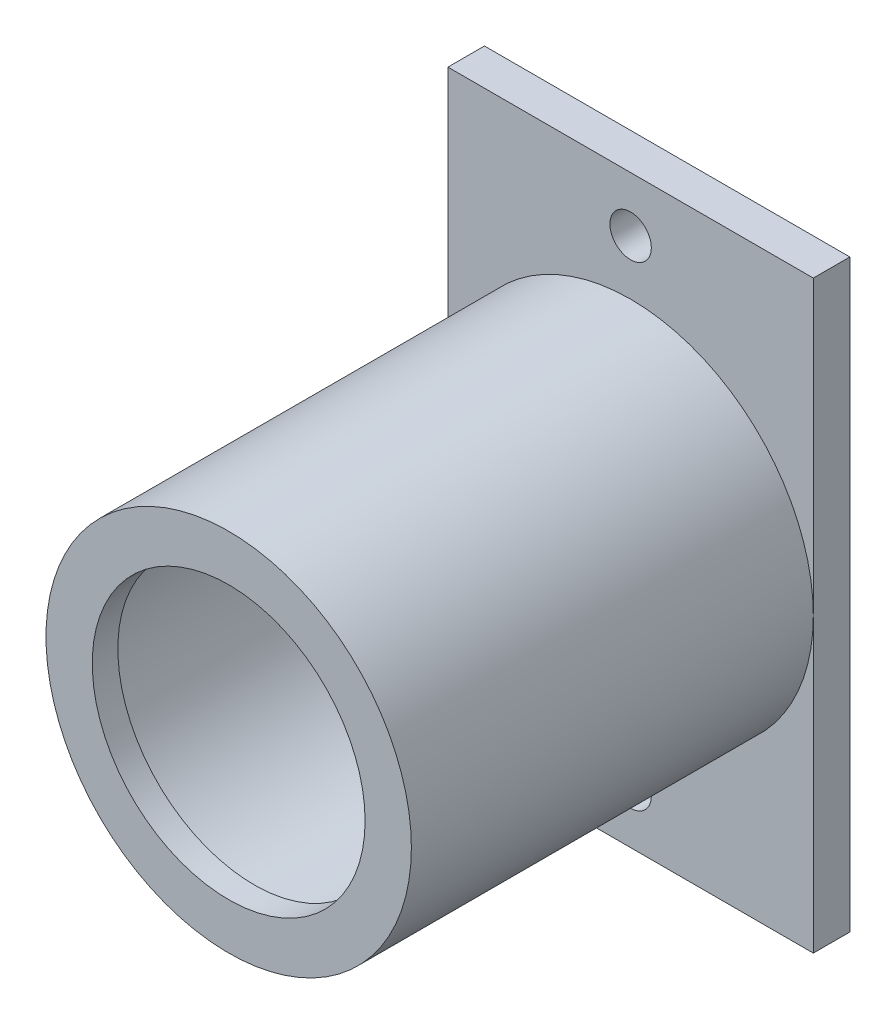
ISO-10303-21;
HEADER;
FILE_DESCRIPTION(('STEP AP214'),'2;1');
FILE_NAME('part.step','',(''),(''),'','','');
FILE_SCHEMA(('AUTOMOTIVE_DESIGN { 1 0 10303 214 1 1 1 1 }'));
ENDSEC;
DATA;
#1=APPLICATION_CONTEXT('core data for automotive mechanical design processes');
#2=APPLICATION_PROTOCOL_DEFINITION('international standard','automotive_design',2000,#1);
#3=PRODUCT_CONTEXT('',#1,'mechanical');
#4=PRODUCT('Part','Part','',(#3));
#5=PRODUCT_RELATED_PRODUCT_CATEGORY('part','',(#4));
#6=PRODUCT_DEFINITION_FORMATION('','',#4);
#7=PRODUCT_DEFINITION_CONTEXT('part definition',#1,'design');
#8=PRODUCT_DEFINITION('design','',#6,#7);
#9=PRODUCT_DEFINITION_SHAPE('','',#8);
#10=(LENGTH_UNIT() NAMED_UNIT(*) SI_UNIT(.MILLI.,.METRE.));
#11=(NAMED_UNIT(*) PLANE_ANGLE_UNIT() SI_UNIT($,.RADIAN.));
#12=(NAMED_UNIT(*) SI_UNIT($,.STERADIAN.) SOLID_ANGLE_UNIT());
#13=UNCERTAINTY_MEASURE_WITH_UNIT(LENGTH_MEASURE(1.E-05),#10,'distance_accuracy_value','');
#14=(GEOMETRIC_REPRESENTATION_CONTEXT(3) GLOBAL_UNCERTAINTY_ASSIGNED_CONTEXT((#13)) GLOBAL_UNIT_ASSIGNED_CONTEXT((#10,
#11,#12)) REPRESENTATION_CONTEXT('',''));
#15=CARTESIAN_POINT('',(0.,0.,0.));
#16=DIRECTION('',(0.,0.,1.));
#17=DIRECTION('',(1.,0.,0.));
#18=AXIS2_PLACEMENT_3D('',#15,#16,#17);
#19=CARTESIAN_POINT('',(-183.,76.,245.4));
#20=DIRECTION('',(0.,0.,1.));
#21=DIRECTION('',(1.,0.,0.));
#22=AXIS2_PLACEMENT_3D('',#19,#20,#21);
#23=CYLINDRICAL_SURFACE('',#22,13.);
#24=DIRECTION('',(0.,0.,1.));
#25=VECTOR('',#24,1.);
#26=CARTESIAN_POINT('',(-170.,76.,245.5));
#27=LINE('',#26,#25);
#28=CARTESIAN_POINT('',(-170.,76.,245.5));
#29=VERTEX_POINT('',#28);
#30=CARTESIAN_POINT('',(-170.,76.,279.4));
#31=VERTEX_POINT('',#30);
#32=EDGE_CURVE('E10',#29,#31,#27,.T.);
#33=ORIENTED_EDGE('',*,*,#32,.F.);
#34=CARTESIAN_POINT('',(-183.,76.,245.5));
#35=DIRECTION('',(0.,0.,1.));
#36=DIRECTION('',(1.,0.,0.));
#37=AXIS2_PLACEMENT_3D('',#34,#35,#36);
#38=CIRCLE('',#37,13.);
#39=EDGE_CURVE('E208',#29,#29,#38,.T.);
#40=ORIENTED_EDGE('',*,*,#39,.F.);
#41=ORIENTED_EDGE('',*,*,#32,.T.);
#42=CARTESIAN_POINT('',(-183.,76.,279.4));
#43=DIRECTION('',(0.,0.,1.));
#44=DIRECTION('',(1.,0.,0.));
#45=AXIS2_PLACEMENT_3D('',#42,#43,#44);
#46=CIRCLE('',#45,13.);
#47=EDGE_CURVE('E18',#31,#31,#46,.T.);
#48=ORIENTED_EDGE('',*,*,#47,.T.);
#49=EDGE_LOOP('',(#33,#40,#41,#48));
#50=FACE_BOUND('',#49,.T.);
#51=ADVANCED_FACE('F15',(#50),#23,.F.);
#52=CARTESIAN_POINT('',(-183.,76.,279.4));
#53=DIRECTION('',(0.,0.,1.));
#54=DIRECTION('',(1.,0.,0.));
#55=AXIS2_PLACEMENT_3D('',#52,#53,#54);
#56=PLANE('',#55);
#57=CARTESIAN_POINT('',(-183.,76.,279.4));
#58=DIRECTION('',(0.,0.,1.));
#59=DIRECTION('',(1.,0.,0.));
#60=AXIS2_PLACEMENT_3D('',#57,#58,#59);
#61=CIRCLE('',#60,11.2);
#62=CARTESIAN_POINT('',(-171.8,76.,279.4));
#63=VERTEX_POINT('',#62);
#64=EDGE_CURVE('E167',#63,#63,#61,.T.);
#65=ORIENTED_EDGE('',*,*,#64,.T.);
#66=EDGE_LOOP('',(#65));
#67=FACE_BOUND('',#66,.T.);
#68=ORIENTED_EDGE('',*,*,#47,.F.);
#69=EDGE_LOOP('',(#68));
#70=FACE_BOUND('',#69,.T.);
#71=ADVANCED_FACE('F244',(#67,#70),#56,.F.);
#72=CARTESIAN_POINT('',(-198.,52.,245.5));
#73=DIRECTION('',(0.,0.,1.));
#74=DIRECTION('',(1.,0.,0.));
#75=AXIS2_PLACEMENT_3D('',#72,#73,#74);
#76=PLANE('',#75);
#77=CARTESIAN_POINT('',(-183.,95.5,245.5));
#78=DIRECTION('',(0.,0.,1.));
#79=DIRECTION('',(1.,0.,0.));
#80=AXIS2_PLACEMENT_3D('',#77,#78,#79);
#81=CIRCLE('',#80,1.7);
#82=CARTESIAN_POINT('',(-181.3,95.5,245.5));
#83=VERTEX_POINT('',#82);
#84=EDGE_CURVE('E144',#83,#83,#81,.T.);
#85=ORIENTED_EDGE('',*,*,#84,.T.);
#86=EDGE_LOOP('',(#85));
#87=FACE_BOUND('',#86,.T.);
#88=ORIENTED_EDGE('',*,*,#39,.T.);
#89=EDGE_LOOP('',(#88));
#90=FACE_BOUND('',#89,.T.);
#91=CARTESIAN_POINT('',(-183.,56.5,245.5));
#92=DIRECTION('',(0.,0.,1.));
#93=DIRECTION('',(1.,0.,0.));
#94=AXIS2_PLACEMENT_3D('',#91,#92,#93);
#95=CIRCLE('',#94,1.7);
#96=CARTESIAN_POINT('',(-181.3,56.5,245.5));
#97=VERTEX_POINT('',#96);
#98=EDGE_CURVE('E125',#97,#97,#95,.T.);
#99=ORIENTED_EDGE('',*,*,#98,.T.);
#100=EDGE_LOOP('',(#99));
#101=FACE_BOUND('',#100,.T.);
#102=DIRECTION('',(0.,-1.,0.));
#103=VECTOR('',#102,1.);
#104=CARTESIAN_POINT('',(-198.,100.,245.5));
#105=LINE('',#104,#103);
#106=CARTESIAN_POINT('',(-198.,100.,245.5));
#107=VERTEX_POINT('',#106);
#108=CARTESIAN_POINT('',(-198.,52.,245.5));
#109=VERTEX_POINT('',#108);
#110=EDGE_CURVE('E171',#107,#109,#105,.T.);
#111=ORIENTED_EDGE('',*,*,#110,.F.);
#112=DIRECTION('',(1.,0.,0.));
#113=VECTOR('',#112,1.);
#114=CARTESIAN_POINT('',(-198.,100.,245.5));
#115=LINE('',#114,#113);
#116=CARTESIAN_POINT('',(-168.,100.,245.5));
#117=VERTEX_POINT('',#116);
#118=EDGE_CURVE('E145',#107,#117,#115,.T.);
#119=ORIENTED_EDGE('',*,*,#118,.T.);
#120=DIRECTION('',(0.,1.,0.));
#121=VECTOR('',#120,1.);
#122=CARTESIAN_POINT('',(-168.,52.,245.5));
#123=LINE('',#122,#121);
#124=CARTESIAN_POINT('',(-168.,52.,245.5));
#125=VERTEX_POINT('',#124);
#126=EDGE_CURVE('E178',#125,#117,#123,.T.);
#127=ORIENTED_EDGE('',*,*,#126,.F.);
#128=DIRECTION('',(1.,0.,0.));
#129=VECTOR('',#128,1.);
#130=CARTESIAN_POINT('',(-198.,52.,245.5));
#131=LINE('',#130,#129);
#132=EDGE_CURVE('E139',#109,#125,#131,.T.);
#133=ORIENTED_EDGE('',*,*,#132,.F.);
#134=EDGE_LOOP('',(#111,#119,#127,#133));
#135=FACE_BOUND('',#134,.T.);
#136=ADVANCED_FACE('F221',(#87,#90,#101,#135),#76,.F.);
#137=CARTESIAN_POINT('',(-183.,76.,279.4));
#138=DIRECTION('',(0.,0.,1.));
#139=DIRECTION('',(1.,0.,0.));
#140=AXIS2_PLACEMENT_3D('',#137,#138,#139);
#141=CYLINDRICAL_SURFACE('',#140,11.2);
#142=DIRECTION('',(0.,0.,1.));
#143=VECTOR('',#142,1.);
#144=CARTESIAN_POINT('',(-171.8,76.,279.4));
#145=LINE('',#144,#143);
#146=CARTESIAN_POINT('',(-171.8,76.,281.5));
#147=VERTEX_POINT('',#146);
#148=EDGE_CURVE('E154',#63,#147,#145,.T.);
#149=ORIENTED_EDGE('',*,*,#148,.F.);
#150=ORIENTED_EDGE('',*,*,#64,.F.);
#151=ORIENTED_EDGE('',*,*,#148,.T.);
#152=CARTESIAN_POINT('',(-183.,76.,281.5));
#153=DIRECTION('',(0.,0.,1.));
#154=DIRECTION('',(1.,0.,0.));
#155=AXIS2_PLACEMENT_3D('',#152,#153,#154);
#156=CIRCLE('',#155,11.2);
#157=EDGE_CURVE('E172',#147,#147,#156,.T.);
#158=ORIENTED_EDGE('',*,*,#157,.T.);
#159=EDGE_LOOP('',(#149,#150,#151,#158));
#160=FACE_BOUND('',#159,.T.);
#161=ADVANCED_FACE('F250',(#160),#141,.F.);
#162=CARTESIAN_POINT('',(-183.,95.5,245.4));
#163=DIRECTION('',(0.,0.,1.));
#164=DIRECTION('',(1.,0.,0.));
#165=AXIS2_PLACEMENT_3D('',#162,#163,#164);
#166=CYLINDRICAL_SURFACE('',#165,1.7);
#167=DIRECTION('',(0.,0.,1.));
#168=VECTOR('',#167,1.);
#169=CARTESIAN_POINT('',(-181.3,95.5,245.4));
#170=LINE('',#169,#168);
#171=CARTESIAN_POINT('',(-181.3,95.5,248.5));
#172=VERTEX_POINT('',#171);
#173=EDGE_CURVE('E141',#83,#172,#170,.T.);
#174=ORIENTED_EDGE('',*,*,#173,.F.);
#175=ORIENTED_EDGE('',*,*,#84,.F.);
#176=ORIENTED_EDGE('',*,*,#173,.T.);
#177=CARTESIAN_POINT('',(-183.,95.5,248.5));
#178=DIRECTION('',(0.,0.,1.));
#179=DIRECTION('',(1.,0.,0.));
#180=AXIS2_PLACEMENT_3D('',#177,#178,#179);
#181=CIRCLE('',#180,1.7);
#182=EDGE_CURVE('E136',#172,#172,#181,.T.);
#183=ORIENTED_EDGE('',*,*,#182,.T.);
#184=EDGE_LOOP('',(#174,#175,#176,#183));
#185=FACE_BOUND('',#184,.T.);
#186=ADVANCED_FACE('F295',(#185),#166,.F.);
#187=CARTESIAN_POINT('',(-198.,100.,245.5));
#188=DIRECTION('',(0.,1.,0.));
#189=DIRECTION('',(1.,0.,0.));
#190=AXIS2_PLACEMENT_3D('',#187,#188,#189);
#191=PLANE('',#190);
#192=ORIENTED_EDGE('',*,*,#118,.F.);
#193=DIRECTION('',(0.,0.,1.));
#194=VECTOR('',#193,1.);
#195=CARTESIAN_POINT('',(-198.,100.,245.5));
#196=LINE('',#195,#194);
#197=CARTESIAN_POINT('',(-198.,100.,248.5));
#198=VERTEX_POINT('',#197);
#199=EDGE_CURVE('E169',#107,#198,#196,.T.);
#200=ORIENTED_EDGE('',*,*,#199,.T.);
#201=DIRECTION('',(1.,0.,0.));
#202=VECTOR('',#201,1.);
#203=CARTESIAN_POINT('',(-198.,100.,248.5));
#204=LINE('',#203,#202);
#205=CARTESIAN_POINT('',(-168.,100.,248.5));
#206=VERTEX_POINT('',#205);
#207=EDGE_CURVE('E132',#198,#206,#204,.T.);
#208=ORIENTED_EDGE('',*,*,#207,.T.);
#209=DIRECTION('',(0.,0.,1.));
#210=VECTOR('',#209,1.);
#211=CARTESIAN_POINT('',(-168.,100.,245.5));
#212=LINE('',#211,#210);
#213=EDGE_CURVE('E180',#117,#206,#212,.T.);
#214=ORIENTED_EDGE('',*,*,#213,.F.);
#215=EDGE_LOOP('',(#192,#200,#208,#214));
#216=FACE_BOUND('',#215,.T.);
#217=ADVANCED_FACE('F230',(#216),#191,.T.);
#218=CARTESIAN_POINT('',(-183.,56.5,245.4));
#219=DIRECTION('',(0.,0.,1.));
#220=DIRECTION('',(1.,0.,0.));
#221=AXIS2_PLACEMENT_3D('',#218,#219,#220);
#222=CYLINDRICAL_SURFACE('',#221,1.7);
#223=DIRECTION('',(0.,0.,1.));
#224=VECTOR('',#223,1.);
#225=CARTESIAN_POINT('',(-181.3,56.5,245.4));
#226=LINE('',#225,#224);
#227=CARTESIAN_POINT('',(-181.3,56.5,248.5));
#228=VERTEX_POINT('',#227);
#229=EDGE_CURVE('E61',#97,#228,#226,.T.);
#230=ORIENTED_EDGE('',*,*,#229,.F.);
#231=ORIENTED_EDGE('',*,*,#98,.F.);
#232=ORIENTED_EDGE('',*,*,#229,.T.);
#233=CARTESIAN_POINT('',(-183.,56.5,248.5));
#234=DIRECTION('',(0.,0.,1.));
#235=DIRECTION('',(1.,0.,0.));
#236=AXIS2_PLACEMENT_3D('',#233,#234,#235);
#237=CIRCLE('',#236,1.7);
#238=EDGE_CURVE('E191',#228,#228,#237,.T.);
#239=ORIENTED_EDGE('',*,*,#238,.T.);
#240=EDGE_LOOP('',(#230,#231,#232,#239));
#241=FACE_BOUND('',#240,.T.);
#242=ADVANCED_FACE('F275',(#241),#222,.F.);
#243=CARTESIAN_POINT('',(-168.,52.,245.5));
#244=DIRECTION('',(1.,0.,0.));
#245=DIRECTION('',(0.,1.,0.));
#246=AXIS2_PLACEMENT_3D('',#243,#244,#245);
#247=PLANE('',#246);
#248=DIRECTION('',(0.,1.,0.));
#249=VECTOR('',#248,1.);
#250=CARTESIAN_POINT('',(-168.,52.,248.5));
#251=LINE('',#250,#249);
#252=CARTESIAN_POINT('',(-168.,52.,248.5));
#253=VERTEX_POINT('',#252);
#254=CARTESIAN_POINT('',(-168.,76.,248.5));
#255=VERTEX_POINT('',#254);
#256=EDGE_CURVE('E130',#253,#255,#251,.T.);
#257=ORIENTED_EDGE('',*,*,#256,.F.);
#258=DIRECTION('',(0.,0.,1.));
#259=VECTOR('',#258,1.);
#260=CARTESIAN_POINT('',(-168.,52.,245.5));
#261=LINE('',#260,#259);
#262=EDGE_CURVE('E75',#125,#253,#261,.T.);
#263=ORIENTED_EDGE('',*,*,#262,.F.);
#264=ORIENTED_EDGE('',*,*,#126,.T.);
#265=ORIENTED_EDGE('',*,*,#213,.T.);
#266=DIRECTION('',(0.,1.,0.));
#267=VECTOR('',#266,1.);
#268=CARTESIAN_POINT('',(-168.,52.,248.5));
#269=LINE('',#268,#267);
#270=EDGE_CURVE('E137',#255,#206,#269,.T.);
#271=ORIENTED_EDGE('',*,*,#270,.F.);
#272=EDGE_LOOP('',(#257,#263,#264,#265,#271));
#273=FACE_BOUND('',#272,.T.);
#274=ADVANCED_FACE('F217',(#273),#247,.T.);
#275=CARTESIAN_POINT('',(-198.,52.,245.5));
#276=DIRECTION('',(0.,1.,0.));
#277=DIRECTION('',(1.,0.,0.));
#278=AXIS2_PLACEMENT_3D('',#275,#276,#277);
#279=PLANE('',#278);
#280=ORIENTED_EDGE('',*,*,#262,.T.);
#281=DIRECTION('',(1.,0.,0.));
#282=VECTOR('',#281,1.);
#283=CARTESIAN_POINT('',(-198.,52.,248.5));
#284=LINE('',#283,#282);
#285=CARTESIAN_POINT('',(-198.,52.,248.5));
#286=VERTEX_POINT('',#285);
#287=EDGE_CURVE('E127',#286,#253,#284,.T.);
#288=ORIENTED_EDGE('',*,*,#287,.F.);
#289=DIRECTION('',(0.,0.,1.));
#290=VECTOR('',#289,1.);
#291=CARTESIAN_POINT('',(-198.,52.,245.5));
#292=LINE('',#291,#290);
#293=EDGE_CURVE('E140',#109,#286,#292,.T.);
#294=ORIENTED_EDGE('',*,*,#293,.F.);
#295=ORIENTED_EDGE('',*,*,#132,.T.);
#296=EDGE_LOOP('',(#280,#288,#294,#295));
#297=FACE_BOUND('',#296,.T.);
#298=ADVANCED_FACE('F223',(#297),#279,.F.);
#299=CARTESIAN_POINT('',(-198.,52.,245.5));
#300=DIRECTION('',(1.,0.,0.));
#301=DIRECTION('',(0.,1.,0.));
#302=AXIS2_PLACEMENT_3D('',#299,#300,#301);
#303=PLANE('',#302);
#304=DIRECTION('',(0.,1.,0.));
#305=VECTOR('',#304,1.);
#306=CARTESIAN_POINT('',(-198.,52.,248.5));
#307=LINE('',#306,#305);
#308=CARTESIAN_POINT('',(-198.,76.,248.5));
#309=VERTEX_POINT('',#308);
#310=EDGE_CURVE('E196',#309,#198,#307,.T.);
#311=ORIENTED_EDGE('',*,*,#310,.T.);
#312=ORIENTED_EDGE('',*,*,#199,.F.);
#313=ORIENTED_EDGE('',*,*,#110,.T.);
#314=ORIENTED_EDGE('',*,*,#293,.T.);
#315=DIRECTION('',(0.,1.,0.));
#316=VECTOR('',#315,1.);
#317=CARTESIAN_POINT('',(-198.,52.,248.5));
#318=LINE('',#317,#316);
#319=EDGE_CURVE('E131',#286,#309,#318,.T.);
#320=ORIENTED_EDGE('',*,*,#319,.T.);
#321=EDGE_LOOP('',(#311,#312,#313,#314,#320));
#322=FACE_BOUND('',#321,.T.);
#323=ADVANCED_FACE('F227',(#322),#303,.F.);
#324=CARTESIAN_POINT('',(-183.,76.,281.5));
#325=DIRECTION('',(0.,0.,1.));
#326=DIRECTION('',(1.,0.,0.));
#327=AXIS2_PLACEMENT_3D('',#324,#325,#326);
#328=PLANE('',#327);
#329=ORIENTED_EDGE('',*,*,#157,.F.);
#330=EDGE_LOOP('',(#329));
#331=FACE_BOUND('',#330,.T.);
#332=CARTESIAN_POINT('',(-183.,76.,281.5));
#333=DIRECTION('',(0.,0.,1.));
#334=DIRECTION('',(1.,0.,0.));
#335=AXIS2_PLACEMENT_3D('',#332,#333,#334);
#336=CIRCLE('',#335,15.);
#337=CARTESIAN_POINT('',(-168.,76.,281.5));
#338=VERTEX_POINT('',#337);
#339=EDGE_CURVE('E105',#338,#338,#336,.T.);
#340=ORIENTED_EDGE('',*,*,#339,.T.);
#341=EDGE_LOOP('',(#340));
#342=FACE_BOUND('',#341,.T.);
#343=ADVANCED_FACE('F106',(#331,#342),#328,.T.);
#344=CARTESIAN_POINT('',(-198.,52.,248.5));
#345=DIRECTION('',(0.,0.,1.));
#346=DIRECTION('',(1.,0.,0.));
#347=AXIS2_PLACEMENT_3D('',#344,#345,#346);
#348=PLANE('',#347);
#349=ORIENTED_EDGE('',*,*,#182,.F.);
#350=EDGE_LOOP('',(#349));
#351=FACE_BOUND('',#350,.T.);
#352=ORIENTED_EDGE('',*,*,#310,.F.);
#353=CARTESIAN_POINT('',(-183.,76.,248.5));
#354=DIRECTION('',(0.,0.,1.));
#355=DIRECTION('',(1.,0.,0.));
#356=AXIS2_PLACEMENT_3D('',#353,#354,#355);
#357=CIRCLE('',#356,15.);
#358=EDGE_CURVE('E111',#255,#309,#357,.T.);
#359=ORIENTED_EDGE('',*,*,#358,.F.);
#360=ORIENTED_EDGE('',*,*,#270,.T.);
#361=ORIENTED_EDGE('',*,*,#207,.F.);
#362=EDGE_LOOP('',(#352,#359,#360,#361));
#363=FACE_BOUND('',#362,.T.);
#364=ADVANCED_FACE('F233',(#351,#363),#348,.T.);
#365=CARTESIAN_POINT('',(-198.,52.,248.5));
#366=DIRECTION('',(0.,0.,1.));
#367=DIRECTION('',(1.,0.,0.));
#368=AXIS2_PLACEMENT_3D('',#365,#366,#367);
#369=PLANE('',#368);
#370=ORIENTED_EDGE('',*,*,#238,.F.);
#371=EDGE_LOOP('',(#370));
#372=FACE_BOUND('',#371,.T.);
#373=ORIENTED_EDGE('',*,*,#319,.F.);
#374=ORIENTED_EDGE('',*,*,#287,.T.);
#375=ORIENTED_EDGE('',*,*,#256,.T.);
#376=CARTESIAN_POINT('',(-183.,76.,248.5));
#377=DIRECTION('',(0.,0.,1.));
#378=DIRECTION('',(1.,0.,0.));
#379=AXIS2_PLACEMENT_3D('',#376,#377,#378);
#380=CIRCLE('',#379,15.);
#381=EDGE_CURVE('E119',#309,#255,#380,.T.);
#382=ORIENTED_EDGE('',*,*,#381,.F.);
#383=EDGE_LOOP('',(#373,#374,#375,#382));
#384=FACE_BOUND('',#383,.T.);
#385=ADVANCED_FACE('F260',(#372,#384),#369,.T.);
#386=CARTESIAN_POINT('',(-183.,76.,245.5));
#387=DIRECTION('',(0.,0.,1.));
#388=DIRECTION('',(1.,0.,0.));
#389=AXIS2_PLACEMENT_3D('',#386,#387,#388);
#390=CYLINDRICAL_SURFACE('',#389,15.);
#391=DIRECTION('',(0.,0.,1.));
#392=VECTOR('',#391,1.);
#393=CARTESIAN_POINT('',(-168.,76.,245.5));
#394=LINE('',#393,#392);
#395=EDGE_CURVE('E112',#255,#338,#394,.T.);
#396=ORIENTED_EDGE('',*,*,#395,.T.);
#397=ORIENTED_EDGE('',*,*,#339,.F.);
#398=ORIENTED_EDGE('',*,*,#395,.F.);
#399=ORIENTED_EDGE('',*,*,#358,.T.);
#400=ORIENTED_EDGE('',*,*,#381,.T.);
#401=EDGE_LOOP('',(#396,#397,#398,#399,#400));
#402=FACE_BOUND('',#401,.T.);
#403=ADVANCED_FACE('F280',(#402),#390,.T.);
#404=CLOSED_SHELL('',(#51,#71,#136,#161,#186,#217,#242,#274,#298,#323,#343,#364,#385,#403));
#405=MANIFOLD_SOLID_BREP('B1',#404);
#406=ADVANCED_BREP_SHAPE_REPRESENTATION('',(#18,#405),#14);
#407=SHAPE_DEFINITION_REPRESENTATION(#9,#406);
ENDSEC;
END-ISO-10303-21;
